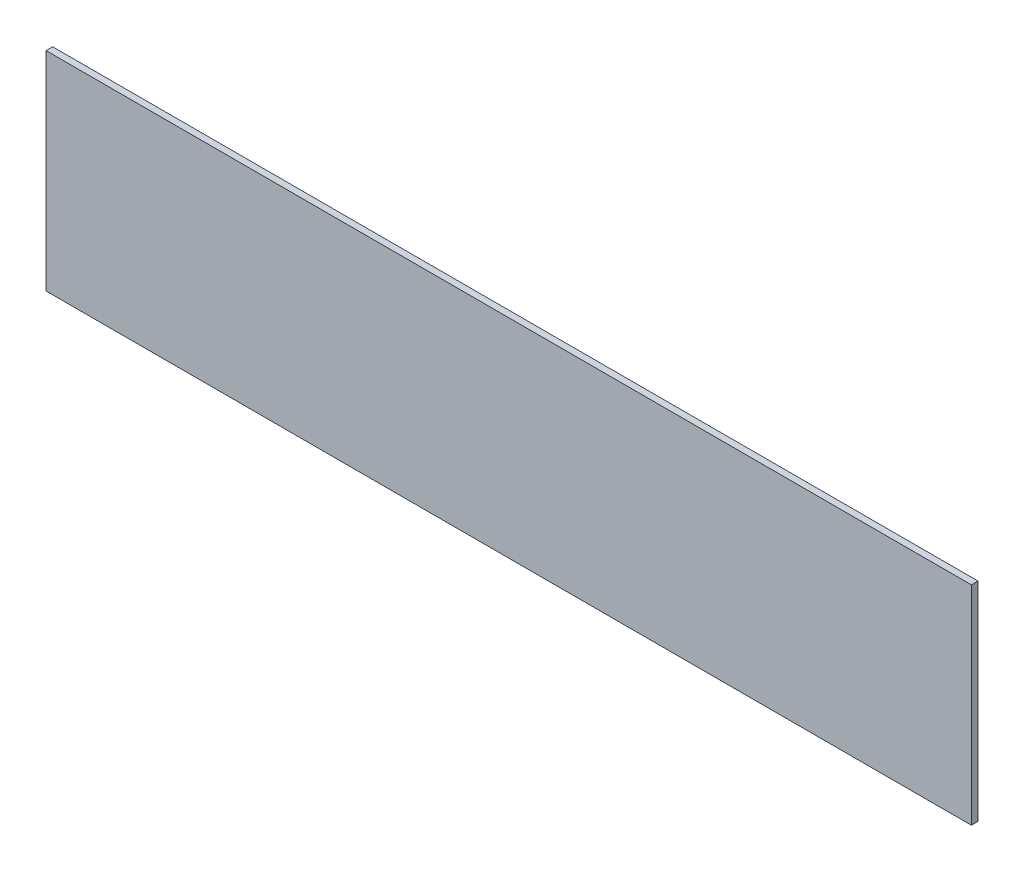
ISO-10303-21;
HEADER;
FILE_DESCRIPTION(('STEP AP214'),'2;1');
FILE_NAME('part.step','',(''),(''),'','','');
FILE_SCHEMA(('AUTOMOTIVE_DESIGN { 1 0 10303 214 1 1 1 1 }'));
ENDSEC;
DATA;
#1=APPLICATION_CONTEXT('core data for automotive mechanical design processes');
#2=APPLICATION_PROTOCOL_DEFINITION('international standard','automotive_design',2000,#1);
#3=PRODUCT_CONTEXT('',#1,'mechanical');
#4=PRODUCT('Part','Part','',(#3));
#5=PRODUCT_RELATED_PRODUCT_CATEGORY('part','',(#4));
#6=PRODUCT_DEFINITION_FORMATION('','',#4);
#7=PRODUCT_DEFINITION_CONTEXT('part definition',#1,'design');
#8=PRODUCT_DEFINITION('design','',#6,#7);
#9=PRODUCT_DEFINITION_SHAPE('','',#8);
#10=(LENGTH_UNIT() NAMED_UNIT(*) SI_UNIT(.MILLI.,.METRE.));
#11=(NAMED_UNIT(*) PLANE_ANGLE_UNIT() SI_UNIT($,.RADIAN.));
#12=(NAMED_UNIT(*) SI_UNIT($,.STERADIAN.) SOLID_ANGLE_UNIT());
#13=UNCERTAINTY_MEASURE_WITH_UNIT(LENGTH_MEASURE(1.E-05),#10,'distance_accuracy_value','');
#14=(GEOMETRIC_REPRESENTATION_CONTEXT(3) GLOBAL_UNCERTAINTY_ASSIGNED_CONTEXT((#13)) GLOBAL_UNIT_ASSIGNED_CONTEXT((#10,
#11,#12)) REPRESENTATION_CONTEXT('',''));
#15=CARTESIAN_POINT('',(0.,0.,0.));
#16=DIRECTION('',(0.,0.,1.));
#17=DIRECTION('',(1.,0.,0.));
#18=AXIS2_PLACEMENT_3D('',#15,#16,#17);
#19=CARTESIAN_POINT('',(-388.90571225146,66.4525336152109,-3.175));
#20=DIRECTION('',(-1.,0.,0.));
#21=DIRECTION('',(0.,0.,1.));
#22=AXIS2_PLACEMENT_3D('',#19,#20,#21);
#23=PLANE('',#22);
#24=DIRECTION('',(0.,-1.,0.));
#25=VECTOR('',#24,1.);
#26=CARTESIAN_POINT('',(-388.90571225146,66.4525336152109,0.));
#27=LINE('',#26,#25);
#28=CARTESIAN_POINT('',(-388.90571225146,66.4525336152109,0.));
#29=VERTEX_POINT('',#28);
#30=CARTESIAN_POINT('',(-388.90571225146,-33.5599663847891,0.));
#31=VERTEX_POINT('',#30);
#32=EDGE_CURVE('E97',#29,#31,#27,.T.);
#33=ORIENTED_EDGE('',*,*,#32,.F.);
#34=DIRECTION('',(0.,0.,1.));
#35=VECTOR('',#34,1.);
#36=CARTESIAN_POINT('',(-388.90571225146,66.4525336152109,-3.175));
#37=LINE('',#36,#35);
#38=CARTESIAN_POINT('',(-388.90571225146,66.4525336152109,-3.175));
#39=VERTEX_POINT('',#38);
#40=EDGE_CURVE('E11',#39,#29,#37,.T.);
#41=ORIENTED_EDGE('',*,*,#40,.F.);
#42=DIRECTION('',(0.,-1.,0.));
#43=VECTOR('',#42,1.);
#44=CARTESIAN_POINT('',(-388.90571225146,66.4525336152109,-3.175));
#45=LINE('',#44,#43);
#46=CARTESIAN_POINT('',(-388.90571225146,-33.5599663847891,-3.175));
#47=VERTEX_POINT('',#46);
#48=EDGE_CURVE('E91',#39,#47,#45,.T.);
#49=ORIENTED_EDGE('',*,*,#48,.T.);
#50=DIRECTION('',(0.,0.,1.));
#51=VECTOR('',#50,1.);
#52=CARTESIAN_POINT('',(-388.90571225146,-33.5599663847891,-3.175));
#53=LINE('',#52,#51);
#54=EDGE_CURVE('E36',#47,#31,#53,.T.);
#55=ORIENTED_EDGE('',*,*,#54,.T.);
#56=EDGE_LOOP('',(#33,#41,#49,#55));
#57=FACE_BOUND('',#56,.T.);
#58=ADVANCED_FACE('F33',(#57),#23,.T.);
#59=CARTESIAN_POINT('',(-388.90571225146,66.4525336152109,-3.175));
#60=DIRECTION('',(0.,1.,0.));
#61=DIRECTION('',(0.,0.,1.));
#62=AXIS2_PLACEMENT_3D('',#59,#60,#61);
#63=PLANE('',#62);
#64=DIRECTION('',(-1.,0.,0.));
#65=VECTOR('',#64,1.);
#66=CARTESIAN_POINT('',(-388.90571225146,66.4525336152109,0.));
#67=LINE('',#66,#65);
#68=CARTESIAN_POINT('',(55.5942877485395,66.4525336152109,0.));
#69=VERTEX_POINT('',#68);
#70=EDGE_CURVE('E93',#69,#29,#67,.T.);
#71=ORIENTED_EDGE('',*,*,#70,.F.);
#72=DIRECTION('',(0.,0.,1.));
#73=VECTOR('',#72,1.);
#74=CARTESIAN_POINT('',(55.5942877485395,66.4525336152109,-3.175));
#75=LINE('',#74,#73);
#76=CARTESIAN_POINT('',(55.5942877485395,66.4525336152109,-3.175));
#77=VERTEX_POINT('',#76);
#78=EDGE_CURVE('E42',#77,#69,#75,.T.);
#79=ORIENTED_EDGE('',*,*,#78,.F.);
#80=DIRECTION('',(-1.,0.,0.));
#81=VECTOR('',#80,1.);
#82=CARTESIAN_POINT('',(-388.90571225146,66.4525336152109,-3.175));
#83=LINE('',#82,#81);
#84=EDGE_CURVE('E88',#77,#39,#83,.T.);
#85=ORIENTED_EDGE('',*,*,#84,.T.);
#86=ORIENTED_EDGE('',*,*,#40,.T.);
#87=EDGE_LOOP('',(#71,#79,#85,#86));
#88=FACE_BOUND('',#87,.T.);
#89=ADVANCED_FACE('F107',(#88),#63,.T.);
#90=CARTESIAN_POINT('',(55.5942877485395,66.4525336152109,-3.175));
#91=DIRECTION('',(1.,0.,0.));
#92=DIRECTION('',(0.,1.,0.));
#93=AXIS2_PLACEMENT_3D('',#90,#91,#92);
#94=PLANE('',#93);
#95=DIRECTION('',(0.,1.,0.));
#96=VECTOR('',#95,1.);
#97=CARTESIAN_POINT('',(55.5942877485395,66.4525336152109,0.));
#98=LINE('',#97,#96);
#99=CARTESIAN_POINT('',(55.5942877485396,-33.5599663847891,0.));
#100=VERTEX_POINT('',#99);
#101=EDGE_CURVE('E83',#100,#69,#98,.T.);
#102=ORIENTED_EDGE('',*,*,#101,.F.);
#103=DIRECTION('',(0.,0.,1.));
#104=VECTOR('',#103,1.);
#105=CARTESIAN_POINT('',(55.5942877485396,-33.5599663847891,-3.175));
#106=LINE('',#105,#104);
#107=CARTESIAN_POINT('',(55.5942877485396,-33.5599663847891,-3.175));
#108=VERTEX_POINT('',#107);
#109=EDGE_CURVE('E78',#108,#100,#106,.T.);
#110=ORIENTED_EDGE('',*,*,#109,.F.);
#111=DIRECTION('',(0.,1.,0.));
#112=VECTOR('',#111,1.);
#113=CARTESIAN_POINT('',(55.5942877485395,66.4525336152109,-3.175));
#114=LINE('',#113,#112);
#115=EDGE_CURVE('E81',#108,#77,#114,.T.);
#116=ORIENTED_EDGE('',*,*,#115,.T.);
#117=ORIENTED_EDGE('',*,*,#78,.T.);
#118=EDGE_LOOP('',(#102,#110,#116,#117));
#119=FACE_BOUND('',#118,.T.);
#120=ADVANCED_FACE('F80',(#119),#94,.T.);
#121=CARTESIAN_POINT('',(-388.90571225146,-33.5599663847891,-3.175));
#122=DIRECTION('',(0.,-1.,0.));
#123=DIRECTION('',(0.,0.,-1.));
#124=AXIS2_PLACEMENT_3D('',#121,#122,#123);
#125=PLANE('',#124);
#126=DIRECTION('',(1.,0.,0.));
#127=VECTOR('',#126,1.);
#128=CARTESIAN_POINT('',(-388.90571225146,-33.5599663847891,0.));
#129=LINE('',#128,#127);
#130=EDGE_CURVE('E100',#31,#100,#129,.T.);
#131=ORIENTED_EDGE('',*,*,#130,.F.);
#132=ORIENTED_EDGE('',*,*,#54,.F.);
#133=DIRECTION('',(1.,0.,0.));
#134=VECTOR('',#133,1.);
#135=CARTESIAN_POINT('',(-388.90571225146,-33.5599663847891,-3.175));
#136=LINE('',#135,#134);
#137=EDGE_CURVE('E87',#47,#108,#136,.T.);
#138=ORIENTED_EDGE('',*,*,#137,.T.);
#139=ORIENTED_EDGE('',*,*,#109,.T.);
#140=EDGE_LOOP('',(#131,#132,#138,#139));
#141=FACE_BOUND('',#140,.T.);
#142=ADVANCED_FACE('F90',(#141),#125,.T.);
#143=CARTESIAN_POINT('',(-388.90571225146,-33.5599663847891,-3.175));
#144=DIRECTION('',(0.,0.,1.));
#145=DIRECTION('',(1.,0.,0.));
#146=AXIS2_PLACEMENT_3D('',#143,#144,#145);
#147=PLANE('',#146);
#148=ORIENTED_EDGE('',*,*,#48,.F.);
#149=ORIENTED_EDGE('',*,*,#84,.F.);
#150=ORIENTED_EDGE('',*,*,#115,.F.);
#151=ORIENTED_EDGE('',*,*,#137,.F.);
#152=EDGE_LOOP('',(#148,#149,#150,#151));
#153=FACE_BOUND('',#152,.T.);
#154=ADVANCED_FACE('F86',(#153),#147,.F.);
#155=CARTESIAN_POINT('',(-388.90571225146,-33.5599663847891,0.));
#156=DIRECTION('',(0.,0.,1.));
#157=DIRECTION('',(1.,0.,0.));
#158=AXIS2_PLACEMENT_3D('',#155,#156,#157);
#159=PLANE('',#158);
#160=ORIENTED_EDGE('',*,*,#32,.T.);
#161=ORIENTED_EDGE('',*,*,#130,.T.);
#162=ORIENTED_EDGE('',*,*,#101,.T.);
#163=ORIENTED_EDGE('',*,*,#70,.T.);
#164=EDGE_LOOP('',(#160,#161,#162,#163));
#165=FACE_BOUND('',#164,.T.);
#166=ADVANCED_FACE('F106',(#165),#159,.T.);
#167=CLOSED_SHELL('',(#58,#89,#120,#142,#154,#166));
#168=MANIFOLD_SOLID_BREP('B2',#167);
#169=ADVANCED_BREP_SHAPE_REPRESENTATION('',(#18,#168),#14);
#170=SHAPE_DEFINITION_REPRESENTATION(#9,#169);
ENDSEC;
END-ISO-10303-21;
